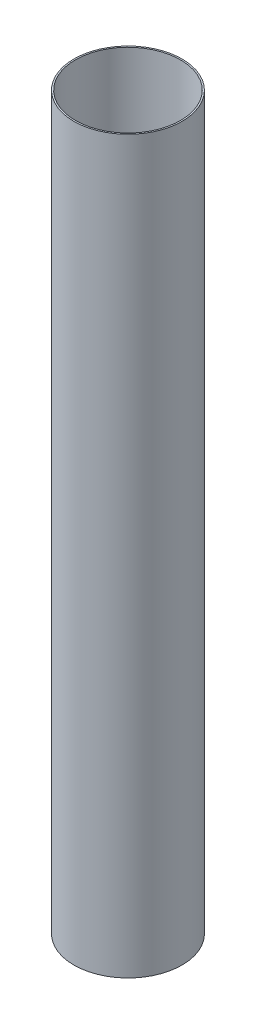
ISO-10303-21;
HEADER;
FILE_DESCRIPTION(('STEP AP214'),'2;1');
FILE_NAME('part.step','',(''),(''),'','','');
FILE_SCHEMA(('AUTOMOTIVE_DESIGN { 1 0 10303 214 1 1 1 1 }'));
ENDSEC;
DATA;
#1=APPLICATION_CONTEXT('core data for automotive mechanical design processes');
#2=APPLICATION_PROTOCOL_DEFINITION('international standard','automotive_design',2000,#1);
#3=PRODUCT_CONTEXT('',#1,'mechanical');
#4=PRODUCT('Part','Part','',(#3));
#5=PRODUCT_RELATED_PRODUCT_CATEGORY('part','',(#4));
#6=PRODUCT_DEFINITION_FORMATION('','',#4);
#7=PRODUCT_DEFINITION_CONTEXT('part definition',#1,'design');
#8=PRODUCT_DEFINITION('design','',#6,#7);
#9=PRODUCT_DEFINITION_SHAPE('','',#8);
#10=(LENGTH_UNIT() NAMED_UNIT(*) SI_UNIT(.MILLI.,.METRE.));
#11=(NAMED_UNIT(*) PLANE_ANGLE_UNIT() SI_UNIT($,.RADIAN.));
#12=(NAMED_UNIT(*) SI_UNIT($,.STERADIAN.) SOLID_ANGLE_UNIT());
#13=UNCERTAINTY_MEASURE_WITH_UNIT(LENGTH_MEASURE(1.E-05),#10,'distance_accuracy_value','');
#14=(GEOMETRIC_REPRESENTATION_CONTEXT(3) GLOBAL_UNCERTAINTY_ASSIGNED_CONTEXT((#13)) GLOBAL_UNIT_ASSIGNED_CONTEXT((#10,
#11,#12)) REPRESENTATION_CONTEXT('',''));
#15=CARTESIAN_POINT('',(0.,0.,0.));
#16=DIRECTION('',(0.,0.,1.));
#17=DIRECTION('',(1.,0.,0.));
#18=AXIS2_PLACEMENT_3D('',#15,#16,#17);
#19=CARTESIAN_POINT('',(0.,702.,0.));
#20=DIRECTION('',(0.,1.,0.));
#21=DIRECTION('',(0.,0.,1.));
#22=AXIS2_PLACEMENT_3D('',#19,#20,#21);
#23=PLANE('',#22);
#24=CARTESIAN_POINT('',(0.,702.,0.));
#25=DIRECTION('',(0.,1.,0.));
#26=DIRECTION('',(0.,0.,1.));
#27=AXIS2_PLACEMENT_3D('',#24,#25,#26);
#28=CIRCLE('',#27,51.95);
#29=CARTESIAN_POINT('',(0.,702.,51.95));
#30=VERTEX_POINT('',#29);
#31=EDGE_CURVE('E10',#30,#30,#28,.T.);
#32=ORIENTED_EDGE('',*,*,#31,.T.);
#33=EDGE_LOOP('',(#32));
#34=FACE_BOUND('',#33,.T.);
#35=CARTESIAN_POINT('',(0.,702.,0.));
#36=DIRECTION('',(0.,1.,0.));
#37=DIRECTION('',(0.,0.,1.));
#38=AXIS2_PLACEMENT_3D('',#35,#36,#37);
#39=CIRCLE('',#38,50.5);
#40=CARTESIAN_POINT('',(0.,702.,50.5));
#41=VERTEX_POINT('',#40);
#42=EDGE_CURVE('E44',#41,#41,#39,.T.);
#43=ORIENTED_EDGE('',*,*,#42,.F.);
#44=EDGE_LOOP('',(#43));
#45=FACE_BOUND('',#44,.T.);
#46=ADVANCED_FACE('F33',(#34,#45),#23,.T.);
#47=CARTESIAN_POINT('',(0.,0.,0.));
#48=DIRECTION('',(0.,1.,0.));
#49=DIRECTION('',(0.,0.,1.));
#50=AXIS2_PLACEMENT_3D('',#47,#48,#49);
#51=PLANE('',#50);
#52=CARTESIAN_POINT('',(0.,0.,0.));
#53=DIRECTION('',(0.,1.,0.));
#54=DIRECTION('',(0.,0.,1.));
#55=AXIS2_PLACEMENT_3D('',#52,#53,#54);
#56=CIRCLE('',#55,51.95);
#57=CARTESIAN_POINT('',(0.,0.,51.95));
#58=VERTEX_POINT('',#57);
#59=EDGE_CURVE('E37',#58,#58,#56,.T.);
#60=ORIENTED_EDGE('',*,*,#59,.F.);
#61=EDGE_LOOP('',(#60));
#62=FACE_BOUND('',#61,.T.);
#63=CARTESIAN_POINT('',(0.,0.,0.));
#64=DIRECTION('',(0.,1.,0.));
#65=DIRECTION('',(0.,0.,1.));
#66=AXIS2_PLACEMENT_3D('',#63,#64,#65);
#67=CIRCLE('',#66,50.5);
#68=CARTESIAN_POINT('',(0.,0.,50.5));
#69=VERTEX_POINT('',#68);
#70=EDGE_CURVE('E46',#69,#69,#67,.T.);
#71=ORIENTED_EDGE('',*,*,#70,.T.);
#72=EDGE_LOOP('',(#71));
#73=FACE_BOUND('',#72,.T.);
#74=ADVANCED_FACE('F56',(#62,#73),#51,.F.);
#75=CARTESIAN_POINT('',(0.,702.,0.));
#76=DIRECTION('',(0.,-1.,0.));
#77=DIRECTION('',(0.,0.,-1.));
#78=AXIS2_PLACEMENT_3D('',#75,#76,#77);
#79=CYLINDRICAL_SURFACE('',#78,51.95);
#80=ORIENTED_EDGE('',*,*,#31,.F.);
#81=EDGE_LOOP('',(#80));
#82=FACE_BOUND('',#81,.T.);
#83=ORIENTED_EDGE('',*,*,#59,.T.);
#84=EDGE_LOOP('',(#83));
#85=FACE_BOUND('',#84,.T.);
#86=ADVANCED_FACE('F35',(#82,#85),#79,.T.);
#87=CARTESIAN_POINT('',(0.,702.,0.));
#88=DIRECTION('',(0.,-1.,0.));
#89=DIRECTION('',(0.,0.,-1.));
#90=AXIS2_PLACEMENT_3D('',#87,#88,#89);
#91=CYLINDRICAL_SURFACE('',#90,50.5);
#92=ORIENTED_EDGE('',*,*,#42,.T.);
#93=EDGE_LOOP('',(#92));
#94=FACE_BOUND('',#93,.T.);
#95=ORIENTED_EDGE('',*,*,#70,.F.);
#96=EDGE_LOOP('',(#95));
#97=FACE_BOUND('',#96,.T.);
#98=ADVANCED_FACE('F52',(#94,#97),#91,.F.);
#99=CLOSED_SHELL('',(#46,#74,#86,#98));
#100=MANIFOLD_SOLID_BREP('B2',#99);
#101=ADVANCED_BREP_SHAPE_REPRESENTATION('',(#18,#100),#14);
#102=SHAPE_DEFINITION_REPRESENTATION(#9,#101);
ENDSEC;
END-ISO-10303-21;
